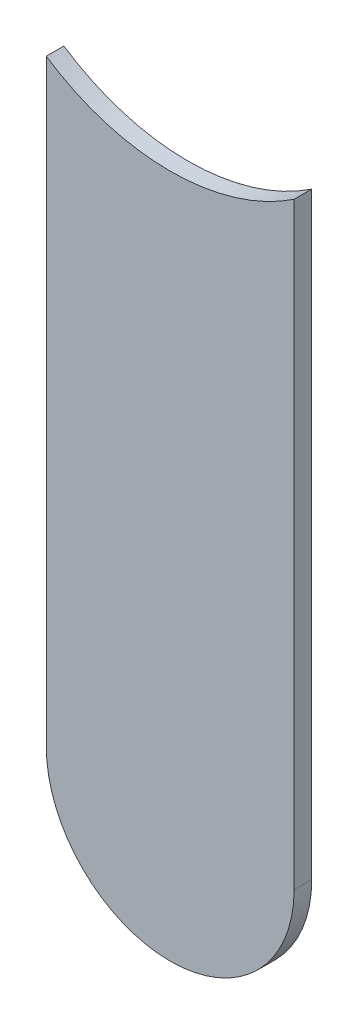
ISO-10303-21;
HEADER;
FILE_DESCRIPTION(('STEP AP214'),'2;1');
FILE_NAME('part.step','',(''),(''),'','','');
FILE_SCHEMA(('AUTOMOTIVE_DESIGN { 1 0 10303 214 1 1 1 1 }'));
ENDSEC;
DATA;
#1=APPLICATION_CONTEXT('core data for automotive mechanical design processes');
#2=APPLICATION_PROTOCOL_DEFINITION('international standard','automotive_design',2000,#1);
#3=PRODUCT_CONTEXT('',#1,'mechanical');
#4=PRODUCT('Part','Part','',(#3));
#5=PRODUCT_RELATED_PRODUCT_CATEGORY('part','',(#4));
#6=PRODUCT_DEFINITION_FORMATION('','',#4);
#7=PRODUCT_DEFINITION_CONTEXT('part definition',#1,'design');
#8=PRODUCT_DEFINITION('design','',#6,#7);
#9=PRODUCT_DEFINITION_SHAPE('','',#8);
#10=(LENGTH_UNIT() NAMED_UNIT(*) SI_UNIT(.MILLI.,.METRE.));
#11=(NAMED_UNIT(*) PLANE_ANGLE_UNIT() SI_UNIT($,.RADIAN.));
#12=(NAMED_UNIT(*) SI_UNIT($,.STERADIAN.) SOLID_ANGLE_UNIT());
#13=UNCERTAINTY_MEASURE_WITH_UNIT(LENGTH_MEASURE(1.E-05),#10,'distance_accuracy_value','');
#14=(GEOMETRIC_REPRESENTATION_CONTEXT(3) GLOBAL_UNCERTAINTY_ASSIGNED_CONTEXT((#13)) GLOBAL_UNIT_ASSIGNED_CONTEXT((#10,
#11,#12)) REPRESENTATION_CONTEXT('',''));
#15=CARTESIAN_POINT('',(0.,0.,0.));
#16=DIRECTION('',(0.,0.,1.));
#17=DIRECTION('',(1.,0.,0.));
#18=AXIS2_PLACEMENT_3D('',#15,#16,#17);
#19=CARTESIAN_POINT('',(100.1499775,114.91987176,0.));
#20=DIRECTION('',(-1.,0.,0.));
#21=DIRECTION('',(0.,1.,0.));
#22=AXIS2_PLACEMENT_3D('',#19,#20,#21);
#23=PLANE('',#22);
#24=DIRECTION('',(0.,1.,0.));
#25=VECTOR('',#24,1.);
#26=CARTESIAN_POINT('',(100.1499775,114.91987176,0.03556));
#27=LINE('',#26,#25);
#28=CARTESIAN_POINT('',(100.1499775,114.91987176,0.03556));
#29=VERTEX_POINT('',#28);
#30=CARTESIAN_POINT('',(100.1499775,116.125830609654,0.03556));
#31=VERTEX_POINT('',#30);
#32=EDGE_CURVE('E11',#29,#31,#27,.T.);
#33=ORIENTED_EDGE('',*,*,#32,.F.);
#34=DIRECTION('',(0.,0.,1.));
#35=VECTOR('',#34,1.);
#36=CARTESIAN_POINT('',(100.1499775,114.91987176,0.));
#37=LINE('',#36,#35);
#38=CARTESIAN_POINT('',(100.1499775,114.91987176,0.));
#39=VERTEX_POINT('',#38);
#40=EDGE_CURVE('E24',#39,#29,#37,.T.);
#41=ORIENTED_EDGE('',*,*,#40,.F.);
#42=DIRECTION('',(0.,1.,0.));
#43=VECTOR('',#42,1.);
#44=CARTESIAN_POINT('',(100.1499775,114.91987176,0.));
#45=LINE('',#44,#43);
#46=CARTESIAN_POINT('',(100.1499775,116.125830609654,0.));
#47=VERTEX_POINT('',#46);
#48=EDGE_CURVE('E75',#39,#47,#45,.T.);
#49=ORIENTED_EDGE('',*,*,#48,.T.);
#50=DIRECTION('',(0.,0.,1.));
#51=VECTOR('',#50,1.);
#52=CARTESIAN_POINT('',(100.1499775,116.125830609654,0.));
#53=LINE('',#52,#51);
#54=EDGE_CURVE('E37',#47,#31,#53,.T.);
#55=ORIENTED_EDGE('',*,*,#54,.T.);
#56=EDGE_LOOP('',(#33,#41,#49,#55));
#57=FACE_BOUND('',#56,.T.);
#58=ADVANCED_FACE('F17',(#57),#23,.F.);
#59=CARTESIAN_POINT('',(99.899978,116.4999956,0.));
#60=DIRECTION('',(0.,0.,-1.));
#61=DIRECTION('',(1.,0.,0.));
#62=AXIS2_PLACEMENT_3D('',#59,#60,#61);
#63=CYLINDRICAL_SURFACE('',#62,0.4499991);
#64=DIRECTION('',(0.,0.,1.));
#65=VECTOR('',#64,1.);
#66=CARTESIAN_POINT('',(99.6499785,116.125830609654,0.));
#67=LINE('',#66,#65);
#68=CARTESIAN_POINT('',(99.6499785,116.125830609654,0.));
#69=VERTEX_POINT('',#68);
#70=CARTESIAN_POINT('',(99.6499785,116.125830609654,0.03556));
#71=VERTEX_POINT('',#70);
#72=EDGE_CURVE('E67',#69,#71,#67,.T.);
#73=ORIENTED_EDGE('',*,*,#72,.T.);
#74=CARTESIAN_POINT('',(99.899978,116.4999956,0.03556));
#75=DIRECTION('',(0.,0.,1.));
#76=DIRECTION('',(1.,0.,0.));
#77=AXIS2_PLACEMENT_3D('',#74,#75,#76);
#78=CIRCLE('',#77,0.4499991);
#79=EDGE_CURVE('E82',#71,#31,#78,.T.);
#80=ORIENTED_EDGE('',*,*,#79,.T.);
#81=ORIENTED_EDGE('',*,*,#54,.F.);
#82=CARTESIAN_POINT('',(99.899978,116.4999956,0.));
#83=DIRECTION('',(0.,0.,1.));
#84=DIRECTION('',(1.,0.,0.));
#85=AXIS2_PLACEMENT_3D('',#82,#83,#84);
#86=CIRCLE('',#85,0.4499991);
#87=EDGE_CURVE('E80',#69,#47,#86,.T.);
#88=ORIENTED_EDGE('',*,*,#87,.F.);
#89=EDGE_LOOP('',(#73,#80,#81,#88));
#90=FACE_BOUND('',#89,.T.);
#91=ADVANCED_FACE('F88',(#90),#63,.F.);
#92=CARTESIAN_POINT('',(99.6499785,116.125830609654,0.));
#93=DIRECTION('',(1.,0.,0.));
#94=DIRECTION('',(0.,-1.,0.));
#95=AXIS2_PLACEMENT_3D('',#92,#93,#94);
#96=PLANE('',#95);
#97=DIRECTION('',(0.,-1.,0.));
#98=VECTOR('',#97,1.);
#99=CARTESIAN_POINT('',(99.6499785,116.4999956,0.03556));
#100=LINE('',#99,#98);
#101=CARTESIAN_POINT('',(99.6499785,114.91987176,0.03556));
#102=VERTEX_POINT('',#101);
#103=EDGE_CURVE('E71',#71,#102,#100,.T.);
#104=ORIENTED_EDGE('',*,*,#103,.F.);
#105=ORIENTED_EDGE('',*,*,#72,.F.);
#106=DIRECTION('',(0.,-1.,0.));
#107=VECTOR('',#106,1.);
#108=CARTESIAN_POINT('',(99.6499785,116.4999956,0.));
#109=LINE('',#108,#107);
#110=CARTESIAN_POINT('',(99.6499785,114.91987176,0.));
#111=VERTEX_POINT('',#110);
#112=EDGE_CURVE('E63',#69,#111,#109,.T.);
#113=ORIENTED_EDGE('',*,*,#112,.T.);
#114=DIRECTION('',(0.,0.,1.));
#115=VECTOR('',#114,1.);
#116=CARTESIAN_POINT('',(99.6499785,114.91987176,0.));
#117=LINE('',#116,#115);
#118=EDGE_CURVE('E53',#111,#102,#117,.T.);
#119=ORIENTED_EDGE('',*,*,#118,.T.);
#120=EDGE_LOOP('',(#104,#105,#113,#119));
#121=FACE_BOUND('',#120,.T.);
#122=ADVANCED_FACE('F66',(#121),#96,.F.);
#123=CARTESIAN_POINT('',(99.899978,114.91987176,0.));
#124=DIRECTION('',(0.,0.,-1.));
#125=DIRECTION('',(-1.,0.,0.));
#126=AXIS2_PLACEMENT_3D('',#123,#124,#125);
#127=CYLINDRICAL_SURFACE('',#126,0.249999500000001);
#128=CARTESIAN_POINT('',(99.899978,114.91987176,0.03556));
#129=DIRECTION('',(0.,0.,1.));
#130=DIRECTION('',(-1.,0.,0.));
#131=AXIS2_PLACEMENT_3D('',#128,#129,#130);
#132=CIRCLE('',#131,0.249999500000001);
#133=EDGE_CURVE('E59',#102,#29,#132,.T.);
#134=ORIENTED_EDGE('',*,*,#133,.F.);
#135=ORIENTED_EDGE('',*,*,#118,.F.);
#136=CARTESIAN_POINT('',(99.899978,114.91987176,0.));
#137=DIRECTION('',(0.,0.,1.));
#138=DIRECTION('',(-1.,0.,0.));
#139=AXIS2_PLACEMENT_3D('',#136,#137,#138);
#140=CIRCLE('',#139,0.249999500000001);
#141=EDGE_CURVE('E57',#111,#39,#140,.T.);
#142=ORIENTED_EDGE('',*,*,#141,.T.);
#143=ORIENTED_EDGE('',*,*,#40,.T.);
#144=EDGE_LOOP('',(#134,#135,#142,#143));
#145=FACE_BOUND('',#144,.T.);
#146=ADVANCED_FACE('F55',(#145),#127,.T.);
#147=CARTESIAN_POINT('',(100.1499775,114.91987176,0.));
#148=DIRECTION('',(0.,0.,-1.));
#149=DIRECTION('',(-1.,0.,0.));
#150=AXIS2_PLACEMENT_3D('',#147,#148,#149);
#151=PLANE('',#150);
#152=ORIENTED_EDGE('',*,*,#48,.F.);
#153=ORIENTED_EDGE('',*,*,#141,.F.);
#154=ORIENTED_EDGE('',*,*,#112,.F.);
#155=ORIENTED_EDGE('',*,*,#87,.T.);
#156=EDGE_LOOP('',(#152,#153,#154,#155));
#157=FACE_BOUND('',#156,.T.);
#158=ADVANCED_FACE('F74',(#157),#151,.T.);
#159=CARTESIAN_POINT('',(100.1499775,114.91987176,0.03556));
#160=DIRECTION('',(0.,0.,-1.));
#161=DIRECTION('',(-1.,0.,0.));
#162=AXIS2_PLACEMENT_3D('',#159,#160,#161);
#163=PLANE('',#162);
#164=ORIENTED_EDGE('',*,*,#133,.T.);
#165=ORIENTED_EDGE('',*,*,#32,.T.);
#166=ORIENTED_EDGE('',*,*,#79,.F.);
#167=ORIENTED_EDGE('',*,*,#103,.T.);
#168=EDGE_LOOP('',(#164,#165,#166,#167));
#169=FACE_BOUND('',#168,.T.);
#170=ADVANCED_FACE('F91',(#169),#163,.F.);
#171=CLOSED_SHELL('',(#58,#91,#122,#146,#158,#170));
#172=MANIFOLD_SOLID_BREP('B1',#171);
#173=ADVANCED_BREP_SHAPE_REPRESENTATION('',(#18,#172),#14);
#174=SHAPE_DEFINITION_REPRESENTATION(#9,#173);
ENDSEC;
END-ISO-10303-21;
